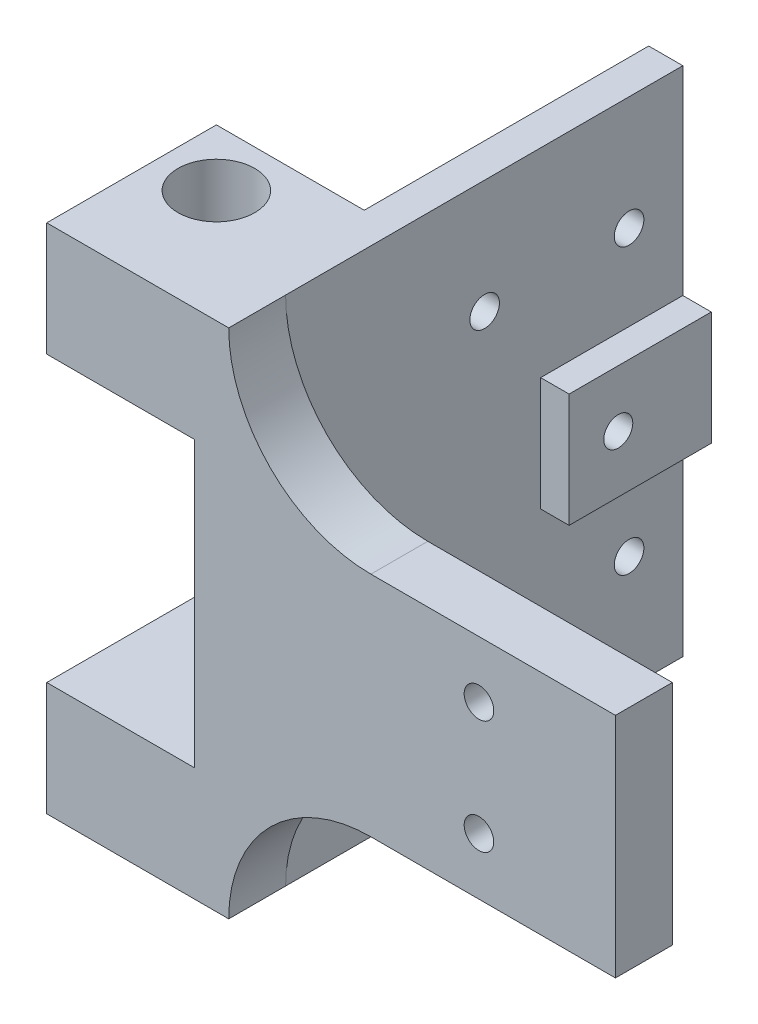
ISO-10303-21;
HEADER;
FILE_DESCRIPTION(('STEP AP214'),'2;1');
FILE_NAME('part.step','',(''),(''),'','','');
FILE_SCHEMA(('AUTOMOTIVE_DESIGN { 1 0 10303 214 1 1 1 1 }'));
ENDSEC;
DATA;
#1=APPLICATION_CONTEXT('core data for automotive mechanical design processes');
#2=APPLICATION_PROTOCOL_DEFINITION('international standard','automotive_design',2000,#1);
#3=PRODUCT_CONTEXT('',#1,'mechanical');
#4=PRODUCT('Part','Part','',(#3));
#5=PRODUCT_RELATED_PRODUCT_CATEGORY('part','',(#4));
#6=PRODUCT_DEFINITION_FORMATION('','',#4);
#7=PRODUCT_DEFINITION_CONTEXT('part definition',#1,'design');
#8=PRODUCT_DEFINITION('design','',#6,#7);
#9=PRODUCT_DEFINITION_SHAPE('','',#8);
#10=(LENGTH_UNIT() NAMED_UNIT(*) SI_UNIT(.MILLI.,.METRE.));
#11=(NAMED_UNIT(*) PLANE_ANGLE_UNIT() SI_UNIT($,.RADIAN.));
#12=(NAMED_UNIT(*) SI_UNIT($,.STERADIAN.) SOLID_ANGLE_UNIT());
#13=UNCERTAINTY_MEASURE_WITH_UNIT(LENGTH_MEASURE(1.E-05),#10,'distance_accuracy_value','');
#14=(GEOMETRIC_REPRESENTATION_CONTEXT(3) GLOBAL_UNCERTAINTY_ASSIGNED_CONTEXT((#13)) GLOBAL_UNIT_ASSIGNED_CONTEXT((#10,
#11,#12)) REPRESENTATION_CONTEXT('',''));
#15=CARTESIAN_POINT('',(0.,0.,0.));
#16=DIRECTION('',(0.,0.,1.));
#17=DIRECTION('',(1.,0.,0.));
#18=AXIS2_PLACEMENT_3D('',#15,#16,#17);
#19=CARTESIAN_POINT('',(6.,90.,-69.85));
#20=DIRECTION('',(-1.,0.,0.));
#21=DIRECTION('',(0.,-1.,0.));
#22=AXIS2_PLACEMENT_3D('',#19,#20,#21);
#23=PLANE('',#22);
#24=CARTESIAN_POINT('',(5.99999999999999,20.,-35.));
#25=DIRECTION('',(-1.,0.,0.));
#26=DIRECTION('',(0.,-1.,0.));
#27=AXIS2_PLACEMENT_3D('',#24,#25,#26);
#28=CIRCLE('',#27,2.6);
#29=CARTESIAN_POINT('',(5.99999999999999,17.4,-35.));
#30=VERTEX_POINT('',#29);
#31=EDGE_CURVE('E748',#30,#30,#28,.T.);
#32=ORIENTED_EDGE('',*,*,#31,.T.);
#33=EDGE_LOOP('',(#32));
#34=FACE_BOUND('',#33,.T.);
#35=CARTESIAN_POINT('',(6.00000000000001,70.,-60.4));
#36=DIRECTION('',(-1.,0.,0.));
#37=DIRECTION('',(0.,-1.,0.));
#38=AXIS2_PLACEMENT_3D('',#35,#36,#37);
#39=CIRCLE('',#38,2.6);
#40=CARTESIAN_POINT('',(6.00000000000001,67.4,-60.4));
#41=VERTEX_POINT('',#40);
#42=EDGE_CURVE('E750',#41,#41,#39,.T.);
#43=ORIENTED_EDGE('',*,*,#42,.T.);
#44=EDGE_LOOP('',(#43));
#45=FACE_BOUND('',#44,.T.);
#46=CARTESIAN_POINT('',(5.99999999999999,20.,-60.4));
#47=DIRECTION('',(-1.,0.,0.));
#48=DIRECTION('',(0.,-1.,0.));
#49=AXIS2_PLACEMENT_3D('',#46,#47,#48);
#50=CIRCLE('',#49,2.6);
#51=CARTESIAN_POINT('',(5.99999999999999,17.4,-60.4));
#52=VERTEX_POINT('',#51);
#53=EDGE_CURVE('E756',#52,#52,#50,.T.);
#54=ORIENTED_EDGE('',*,*,#53,.T.);
#55=EDGE_LOOP('',(#54));
#56=FACE_BOUND('',#55,.T.);
#57=CARTESIAN_POINT('',(6.00000000000001,70.,-35.));
#58=DIRECTION('',(-1.,0.,0.));
#59=DIRECTION('',(0.,-1.,0.));
#60=AXIS2_PLACEMENT_3D('',#57,#58,#59);
#61=CIRCLE('',#60,2.6);
#62=CARTESIAN_POINT('',(6.00000000000001,67.4,-35.));
#63=VERTEX_POINT('',#62);
#64=EDGE_CURVE('E753',#63,#63,#61,.T.);
#65=ORIENTED_EDGE('',*,*,#64,.T.);
#66=EDGE_LOOP('',(#65));
#67=FACE_BOUND('',#66,.T.);
#68=DIRECTION('',(0.,0.,-1.));
#69=VECTOR('',#68,1.);
#70=CARTESIAN_POINT('',(5.99999999999999,35.,-44.85));
#71=LINE('',#70,#69);
#72=CARTESIAN_POINT('',(5.99999999999999,35.,-44.85));
#73=VERTEX_POINT('',#72);
#74=CARTESIAN_POINT('',(5.99999999999999,35.,-69.85));
#75=VERTEX_POINT('',#74);
#76=EDGE_CURVE('E769',#73,#75,#71,.T.);
#77=ORIENTED_EDGE('',*,*,#76,.F.);
#78=DIRECTION('',(0.,-1.,0.));
#79=VECTOR('',#78,1.);
#80=CARTESIAN_POINT('',(6.,55.,-44.85));
#81=LINE('',#80,#79);
#82=CARTESIAN_POINT('',(6.,55.,-44.85));
#83=VERTEX_POINT('',#82);
#84=EDGE_CURVE('E187',#83,#73,#81,.T.);
#85=ORIENTED_EDGE('',*,*,#84,.F.);
#86=DIRECTION('',(0.,0.,1.));
#87=VECTOR('',#86,1.);
#88=CARTESIAN_POINT('',(6.,55.,-44.85));
#89=LINE('',#88,#87);
#90=CARTESIAN_POINT('',(6.,55.,-69.85));
#91=VERTEX_POINT('',#90);
#92=EDGE_CURVE('E183',#91,#83,#89,.T.);
#93=ORIENTED_EDGE('',*,*,#92,.F.);
#94=DIRECTION('',(0.,-1.,0.));
#95=VECTOR('',#94,1.);
#96=CARTESIAN_POINT('',(6.,90.,-69.85));
#97=LINE('',#96,#95);
#98=CARTESIAN_POINT('',(6.,90.,-69.85));
#99=VERTEX_POINT('',#98);
#100=EDGE_CURVE('E282',#99,#91,#97,.T.);
#101=ORIENTED_EDGE('',*,*,#100,.F.);
#102=DIRECTION('',(0.,0.,1.));
#103=VECTOR('',#102,1.);
#104=CARTESIAN_POINT('',(6.,90.,-69.85));
#105=LINE('',#104,#103);
#106=CARTESIAN_POINT('',(6.,90.,0.));
#107=VERTEX_POINT('',#106);
#108=EDGE_CURVE('E294',#99,#107,#105,.T.);
#109=ORIENTED_EDGE('',*,*,#108,.T.);
#110=DIRECTION('',(0.,-1.,0.));
#111=VECTOR('',#110,1.);
#112=CARTESIAN_POINT('',(6.,90.,0.));
#113=LINE('',#112,#111);
#114=CARTESIAN_POINT('',(5.99999999999999,0.,0.));
#115=VERTEX_POINT('',#114);
#116=EDGE_CURVE('E275',#107,#115,#113,.T.);
#117=ORIENTED_EDGE('',*,*,#116,.T.);
#118=DIRECTION('',(0.,0.,1.));
#119=VECTOR('',#118,1.);
#120=CARTESIAN_POINT('',(5.99999999999999,0.,-69.85));
#121=LINE('',#120,#119);
#122=CARTESIAN_POINT('',(5.99999999999999,0.,-69.85));
#123=VERTEX_POINT('',#122);
#124=EDGE_CURVE('E290',#123,#115,#121,.T.);
#125=ORIENTED_EDGE('',*,*,#124,.F.);
#126=EDGE_CURVE('E281',#75,#123,#97,.T.);
#127=ORIENTED_EDGE('',*,*,#126,.F.);
#128=EDGE_LOOP('',(#77,#85,#93,#101,#109,#117,#125,#127));
#129=FACE_BOUND('',#128,.T.);
#130=ADVANCED_FACE('F35',(#34,#45,#56,#67,#129),#23,.F.);
#131=CARTESIAN_POINT('',(0.,0.,10.));
#132=DIRECTION('',(1.,0.,0.));
#133=DIRECTION('',(0.,0.,-1.));
#134=AXIS2_PLACEMENT_3D('',#131,#132,#133);
#135=PLANE('',#134);
#136=CARTESIAN_POINT('',(0.,20.,-35.));
#137=DIRECTION('',(-1.,0.,0.));
#138=DIRECTION('',(0.,0.,1.));
#139=AXIS2_PLACEMENT_3D('',#136,#137,#138);
#140=CIRCLE('',#139,2.6);
#141=CARTESIAN_POINT('',(0.,20.,-32.4));
#142=VERTEX_POINT('',#141);
#143=EDGE_CURVE('E746',#142,#142,#140,.T.);
#144=ORIENTED_EDGE('',*,*,#143,.F.);
#145=EDGE_LOOP('',(#144));
#146=FACE_BOUND('',#145,.T.);
#147=CARTESIAN_POINT('',(0.,70.,-60.4));
#148=DIRECTION('',(-1.,0.,0.));
#149=DIRECTION('',(0.,0.,1.));
#150=AXIS2_PLACEMENT_3D('',#147,#148,#149);
#151=CIRCLE('',#150,2.6);
#152=CARTESIAN_POINT('',(0.,70.,-57.8));
#153=VERTEX_POINT('',#152);
#154=EDGE_CURVE('E792',#153,#153,#151,.T.);
#155=ORIENTED_EDGE('',*,*,#154,.F.);
#156=EDGE_LOOP('',(#155));
#157=FACE_BOUND('',#156,.T.);
#158=CARTESIAN_POINT('',(0.,20.,-60.4));
#159=DIRECTION('',(-1.,0.,0.));
#160=DIRECTION('',(0.,0.,1.));
#161=AXIS2_PLACEMENT_3D('',#158,#159,#160);
#162=CIRCLE('',#161,2.6);
#163=CARTESIAN_POINT('',(0.,20.,-57.8));
#164=VERTEX_POINT('',#163);
#165=EDGE_CURVE('E789',#164,#164,#162,.T.);
#166=ORIENTED_EDGE('',*,*,#165,.F.);
#167=EDGE_LOOP('',(#166));
#168=FACE_BOUND('',#167,.T.);
#169=CARTESIAN_POINT('',(0.,70.,-35.));
#170=DIRECTION('',(-1.,0.,0.));
#171=DIRECTION('',(0.,0.,1.));
#172=AXIS2_PLACEMENT_3D('',#169,#170,#171);
#173=CIRCLE('',#172,2.6);
#174=CARTESIAN_POINT('',(0.,70.,-32.4));
#175=VERTEX_POINT('',#174);
#176=EDGE_CURVE('E749',#175,#175,#173,.T.);
#177=ORIENTED_EDGE('',*,*,#176,.F.);
#178=EDGE_LOOP('',(#177));
#179=FACE_BOUND('',#178,.T.);
#180=CARTESIAN_POINT('',(0.,45.,-53.5));
#181=DIRECTION('',(-1.,0.,0.));
#182=DIRECTION('',(0.,0.,1.));
#183=AXIS2_PLACEMENT_3D('',#180,#181,#182);
#184=CIRCLE('',#183,6.35);
#185=CARTESIAN_POINT('',(0.,45.,-47.15));
#186=VERTEX_POINT('',#185);
#187=EDGE_CURVE('E189',#186,#186,#184,.T.);
#188=ORIENTED_EDGE('',*,*,#187,.F.);
#189=EDGE_LOOP('',(#188));
#190=FACE_BOUND('',#189,.T.);
#191=DIRECTION('',(0.,-1.,0.));
#192=VECTOR('',#191,1.);
#193=CARTESIAN_POINT('',(0.,70.,-19.83));
#194=LINE('',#193,#192);
#195=CARTESIAN_POINT('',(0.,90.,-19.83));
#196=VERTEX_POINT('',#195);
#197=CARTESIAN_POINT('',(0.,70.,-19.83));
#198=VERTEX_POINT('',#197);
#199=EDGE_CURVE('E210',#196,#198,#194,.T.);
#200=ORIENTED_EDGE('',*,*,#199,.F.);
#201=DIRECTION('',(0.,0.,-1.));
#202=VECTOR('',#201,1.);
#203=CARTESIAN_POINT('',(0.,90.,10.));
#204=LINE('',#203,#202);
#205=CARTESIAN_POINT('',(0.,90.,-69.85));
#206=VERTEX_POINT('',#205);
#207=EDGE_CURVE('E319',#196,#206,#204,.T.);
#208=ORIENTED_EDGE('',*,*,#207,.T.);
#209=DIRECTION('',(0.,1.,0.));
#210=VECTOR('',#209,1.);
#211=CARTESIAN_POINT('',(0.,90.,-69.85));
#212=LINE('',#211,#210);
#213=CARTESIAN_POINT('',(0.,0.,-69.85));
#214=VERTEX_POINT('',#213);
#215=EDGE_CURVE('E276',#214,#206,#212,.T.);
#216=ORIENTED_EDGE('',*,*,#215,.F.);
#217=DIRECTION('',(0.,0.,-1.));
#218=VECTOR('',#217,1.);
#219=CARTESIAN_POINT('',(0.,0.,10.));
#220=LINE('',#219,#218);
#221=CARTESIAN_POINT('',(0.,0.,-19.83));
#222=VERTEX_POINT('',#221);
#223=EDGE_CURVE('E322',#222,#214,#220,.T.);
#224=ORIENTED_EDGE('',*,*,#223,.F.);
#225=DIRECTION('',(0.,-1.,0.));
#226=VECTOR('',#225,1.);
#227=CARTESIAN_POINT('',(0.,0.,-19.83));
#228=LINE('',#227,#226);
#229=CARTESIAN_POINT('',(0.,20.,-19.83));
#230=VERTEX_POINT('',#229);
#231=EDGE_CURVE('E239',#230,#222,#228,.T.);
#232=ORIENTED_EDGE('',*,*,#231,.F.);
#233=DIRECTION('',(0.,0.,-1.));
#234=VECTOR('',#233,1.);
#235=CARTESIAN_POINT('',(0.,20.,10.));
#236=LINE('',#235,#234);
#237=CARTESIAN_POINT('',(0.,20.,10.));
#238=VERTEX_POINT('',#237);
#239=EDGE_CURVE('E234',#238,#230,#236,.T.);
#240=ORIENTED_EDGE('',*,*,#239,.F.);
#241=DIRECTION('',(0.,-1.,0.));
#242=VECTOR('',#241,1.);
#243=CARTESIAN_POINT('',(0.,0.,10.));
#244=LINE('',#243,#242);
#245=CARTESIAN_POINT('',(0.,70.,10.));
#246=VERTEX_POINT('',#245);
#247=EDGE_CURVE('E310',#246,#238,#244,.T.);
#248=ORIENTED_EDGE('',*,*,#247,.F.);
#249=DIRECTION('',(0.,0.,1.));
#250=VECTOR('',#249,1.);
#251=CARTESIAN_POINT('',(0.,70.,-19.83));
#252=LINE('',#251,#250);
#253=EDGE_CURVE('E59',#198,#246,#252,.T.);
#254=ORIENTED_EDGE('',*,*,#253,.F.);
#255=EDGE_LOOP('',(#200,#208,#216,#224,#232,#240,#248,#254));
#256=FACE_BOUND('',#255,.T.);
#257=ADVANCED_FACE('F371',(#146,#157,#168,#179,#190,#256),#135,.F.);
#258=CARTESIAN_POINT('',(0.,0.,10.));
#259=DIRECTION('',(0.,0.,-1.));
#260=DIRECTION('',(-1.,0.,0.));
#261=AXIS2_PLACEMENT_3D('',#258,#259,#260);
#262=PLANE('',#261);
#263=DIRECTION('',(1.,0.,0.));
#264=VECTOR('',#263,1.);
#265=CARTESIAN_POINT('',(0.,0.,10.));
#266=LINE('',#265,#264);
#267=CARTESIAN_POINT('',(-26.,0.,10.));
#268=VERTEX_POINT('',#267);
#269=CARTESIAN_POINT('',(5.99999999999999,0.,10.));
#270=VERTEX_POINT('',#269);
#271=EDGE_CURVE('E312',#268,#270,#266,.T.);
#272=ORIENTED_EDGE('',*,*,#271,.T.);
#273=CARTESIAN_POINT('',(31.,0.,10.));
#274=DIRECTION('',(0.,0.,-1.));
#275=DIRECTION('',(-1.,0.,0.));
#276=AXIS2_PLACEMENT_3D('',#273,#274,#275);
#277=CIRCLE('',#276,25.);
#278=CARTESIAN_POINT('',(31.,25.,10.));
#279=VERTEX_POINT('',#278);
#280=EDGE_CURVE('E332',#270,#279,#277,.T.);
#281=ORIENTED_EDGE('',*,*,#280,.T.);
#282=DIRECTION('',(1.,0.,0.));
#283=VECTOR('',#282,1.);
#284=CARTESIAN_POINT('',(74.,25.,10.));
#285=LINE('',#284,#283);
#286=CARTESIAN_POINT('',(74.,25.,10.));
#287=VERTEX_POINT('',#286);
#288=EDGE_CURVE('E260',#279,#287,#285,.T.);
#289=ORIENTED_EDGE('',*,*,#288,.T.);
#290=DIRECTION('',(0.,1.,0.));
#291=VECTOR('',#290,1.);
#292=CARTESIAN_POINT('',(74.,0.,10.));
#293=LINE('',#292,#291);
#294=CARTESIAN_POINT('',(74.,65.,10.));
#295=VERTEX_POINT('',#294);
#296=EDGE_CURVE('E315',#287,#295,#293,.T.);
#297=ORIENTED_EDGE('',*,*,#296,.T.);
#298=DIRECTION('',(-1.,0.,0.));
#299=VECTOR('',#298,1.);
#300=CARTESIAN_POINT('',(74.,65.,10.));
#301=LINE('',#300,#299);
#302=CARTESIAN_POINT('',(31.,65.,10.));
#303=VERTEX_POINT('',#302);
#304=EDGE_CURVE('E267',#295,#303,#301,.T.);
#305=ORIENTED_EDGE('',*,*,#304,.T.);
#306=CARTESIAN_POINT('',(31.,90.,9.99999999999999));
#307=DIRECTION('',(0.,0.,-1.));
#308=DIRECTION('',(-1.,0.,0.));
#309=AXIS2_PLACEMENT_3D('',#306,#307,#308);
#310=CIRCLE('',#309,25.);
#311=CARTESIAN_POINT('',(6.,90.,10.));
#312=VERTEX_POINT('',#311);
#313=EDGE_CURVE('E11',#303,#312,#310,.T.);
#314=ORIENTED_EDGE('',*,*,#313,.T.);
#315=DIRECTION('',(-1.,0.,0.));
#316=VECTOR('',#315,1.);
#317=CARTESIAN_POINT('',(0.,90.,10.));
#318=LINE('',#317,#316);
#319=CARTESIAN_POINT('',(-26.,90.,10.));
#320=VERTEX_POINT('',#319);
#321=EDGE_CURVE('E317',#312,#320,#318,.T.);
#322=ORIENTED_EDGE('',*,*,#321,.T.);
#323=DIRECTION('',(0.,1.,0.));
#324=VECTOR('',#323,1.);
#325=CARTESIAN_POINT('',(-26.,70.,10.));
#326=LINE('',#325,#324);
#327=CARTESIAN_POINT('',(-26.,70.,10.));
#328=VERTEX_POINT('',#327);
#329=EDGE_CURVE('E218',#328,#320,#326,.T.);
#330=ORIENTED_EDGE('',*,*,#329,.F.);
#331=DIRECTION('',(1.,0.,0.));
#332=VECTOR('',#331,1.);
#333=CARTESIAN_POINT('',(-26.,70.,10.));
#334=LINE('',#333,#332);
#335=EDGE_CURVE('E229',#328,#246,#334,.T.);
#336=ORIENTED_EDGE('',*,*,#335,.T.);
#337=ORIENTED_EDGE('',*,*,#247,.T.);
#338=DIRECTION('',(1.,0.,0.));
#339=VECTOR('',#338,1.);
#340=CARTESIAN_POINT('',(-26.,20.,10.));
#341=LINE('',#340,#339);
#342=CARTESIAN_POINT('',(-26.,20.,10.));
#343=VERTEX_POINT('',#342);
#344=EDGE_CURVE('E256',#343,#238,#341,.T.);
#345=ORIENTED_EDGE('',*,*,#344,.F.);
#346=DIRECTION('',(0.,1.,0.));
#347=VECTOR('',#346,1.);
#348=CARTESIAN_POINT('',(-26.,0.,10.));
#349=LINE('',#348,#347);
#350=EDGE_CURVE('E235',#268,#343,#349,.T.);
#351=ORIENTED_EDGE('',*,*,#350,.F.);
#352=EDGE_LOOP('',(#272,#281,#289,#297,#305,#314,#322,#330,#336,#337,#345,#351));
#353=FACE_BOUND('',#352,.T.);
#354=CARTESIAN_POINT('',(50.,55.,10.));
#355=DIRECTION('',(0.,0.,1.));
#356=DIRECTION('',(1.,0.,0.));
#357=AXIS2_PLACEMENT_3D('',#354,#355,#356);
#358=CIRCLE('',#357,2.6);
#359=CARTESIAN_POINT('',(52.6,55.,10.));
#360=VERTEX_POINT('',#359);
#361=EDGE_CURVE('E304',#360,#360,#358,.T.);
#362=ORIENTED_EDGE('',*,*,#361,.F.);
#363=EDGE_LOOP('',(#362));
#364=FACE_BOUND('',#363,.T.);
#365=CARTESIAN_POINT('',(50.,35.,10.));
#366=DIRECTION('',(0.,0.,1.));
#367=DIRECTION('',(1.,0.,0.));
#368=AXIS2_PLACEMENT_3D('',#365,#366,#367);
#369=CIRCLE('',#368,2.6);
#370=CARTESIAN_POINT('',(52.6,35.,10.));
#371=VERTEX_POINT('',#370);
#372=EDGE_CURVE('E298',#371,#371,#369,.T.);
#373=ORIENTED_EDGE('',*,*,#372,.F.);
#374=EDGE_LOOP('',(#373));
#375=FACE_BOUND('',#374,.T.);
#376=ADVANCED_FACE('F352',(#353,#364,#375),#262,.F.);
#377=CARTESIAN_POINT('',(0.,0.,0.));
#378=DIRECTION('',(0.,0.,-1.));
#379=DIRECTION('',(-1.,0.,0.));
#380=AXIS2_PLACEMENT_3D('',#377,#378,#379);
#381=PLANE('',#380);
#382=DIRECTION('',(1.,0.,0.));
#383=VECTOR('',#382,1.);
#384=CARTESIAN_POINT('',(74.,25.,0.));
#385=LINE('',#384,#383);
#386=CARTESIAN_POINT('',(31.,25.,0.));
#387=VERTEX_POINT('',#386);
#388=CARTESIAN_POINT('',(74.,25.,0.));
#389=VERTEX_POINT('',#388);
#390=EDGE_CURVE('E259',#387,#389,#385,.T.);
#391=ORIENTED_EDGE('',*,*,#390,.F.);
#392=CARTESIAN_POINT('',(31.,0.,0.));
#393=DIRECTION('',(0.,0.,-1.));
#394=DIRECTION('',(-1.,0.,0.));
#395=AXIS2_PLACEMENT_3D('',#392,#393,#394);
#396=CIRCLE('',#395,25.);
#397=EDGE_CURVE('E329',#387,#115,#396,.F.);
#398=ORIENTED_EDGE('',*,*,#397,.T.);
#399=ORIENTED_EDGE('',*,*,#116,.F.);
#400=CARTESIAN_POINT('',(31.,90.,0.));
#401=DIRECTION('',(0.,0.,-1.));
#402=DIRECTION('',(-1.,0.,0.));
#403=AXIS2_PLACEMENT_3D('',#400,#401,#402);
#404=CIRCLE('',#403,25.);
#405=CARTESIAN_POINT('',(31.,65.,0.));
#406=VERTEX_POINT('',#405);
#407=EDGE_CURVE('E44',#107,#406,#404,.F.);
#408=ORIENTED_EDGE('',*,*,#407,.T.);
#409=DIRECTION('',(-1.,0.,0.));
#410=VECTOR('',#409,1.);
#411=CARTESIAN_POINT('',(74.,65.,0.));
#412=LINE('',#411,#410);
#413=CARTESIAN_POINT('',(74.,65.,0.));
#414=VERTEX_POINT('',#413);
#415=EDGE_CURVE('E266',#414,#406,#412,.T.);
#416=ORIENTED_EDGE('',*,*,#415,.F.);
#417=DIRECTION('',(0.,1.,0.));
#418=VECTOR('',#417,1.);
#419=CARTESIAN_POINT('',(74.,0.,0.));
#420=LINE('',#419,#418);
#421=EDGE_CURVE('E307',#389,#414,#420,.T.);
#422=ORIENTED_EDGE('',*,*,#421,.F.);
#423=EDGE_LOOP('',(#391,#398,#399,#408,#416,#422));
#424=FACE_BOUND('',#423,.T.);
#425=CARTESIAN_POINT('',(50.,55.,0.));
#426=DIRECTION('',(0.,0.,1.));
#427=DIRECTION('',(1.,0.,0.));
#428=AXIS2_PLACEMENT_3D('',#425,#426,#427);
#429=CIRCLE('',#428,2.6);
#430=CARTESIAN_POINT('',(52.6,55.,0.));
#431=VERTEX_POINT('',#430);
#432=EDGE_CURVE('E301',#431,#431,#429,.T.);
#433=ORIENTED_EDGE('',*,*,#432,.T.);
#434=EDGE_LOOP('',(#433));
#435=FACE_BOUND('',#434,.T.);
#436=CARTESIAN_POINT('',(50.,35.,0.));
#437=DIRECTION('',(0.,0.,1.));
#438=DIRECTION('',(1.,0.,0.));
#439=AXIS2_PLACEMENT_3D('',#436,#437,#438);
#440=CIRCLE('',#439,2.6);
#441=CARTESIAN_POINT('',(52.6,35.,0.));
#442=VERTEX_POINT('',#441);
#443=EDGE_CURVE('E297',#442,#442,#440,.T.);
#444=ORIENTED_EDGE('',*,*,#443,.T.);
#445=EDGE_LOOP('',(#444));
#446=FACE_BOUND('',#445,.T.);
#447=ADVANCED_FACE('F338',(#424,#435,#446),#381,.T.);
#448=CARTESIAN_POINT('',(0.,0.,10.));
#449=DIRECTION('',(0.,1.,0.));
#450=DIRECTION('',(0.,0.,1.));
#451=AXIS2_PLACEMENT_3D('',#448,#449,#450);
#452=PLANE('',#451);
#453=CARTESIAN_POINT('',(-16.,0.,-9.83));
#454=DIRECTION('',(0.,-1.,0.));
#455=DIRECTION('',(0.,0.,-1.));
#456=AXIS2_PLACEMENT_3D('',#453,#454,#455);
#457=CIRCLE('',#456,6.75);
#458=CARTESIAN_POINT('',(-16.,0.,-16.58));
#459=VERTEX_POINT('',#458);
#460=EDGE_CURVE('E204',#459,#459,#457,.T.);
#461=ORIENTED_EDGE('',*,*,#460,.F.);
#462=EDGE_LOOP('',(#461));
#463=FACE_BOUND('',#462,.T.);
#464=ORIENTED_EDGE('',*,*,#124,.T.);
#465=EDGE_CURVE('E288',#115,#270,#121,.T.);
#466=ORIENTED_EDGE('',*,*,#465,.T.);
#467=ORIENTED_EDGE('',*,*,#271,.F.);
#468=DIRECTION('',(0.,0.,1.));
#469=VECTOR('',#468,1.);
#470=CARTESIAN_POINT('',(-26.,0.,10.));
#471=LINE('',#470,#469);
#472=CARTESIAN_POINT('',(-26.,0.,-19.83));
#473=VERTEX_POINT('',#472);
#474=EDGE_CURVE('E243',#473,#268,#471,.T.);
#475=ORIENTED_EDGE('',*,*,#474,.F.);
#476=DIRECTION('',(1.,0.,0.));
#477=VECTOR('',#476,1.);
#478=CARTESIAN_POINT('',(-26.,0.,-19.83));
#479=LINE('',#478,#477);
#480=EDGE_CURVE('E246',#473,#222,#479,.T.);
#481=ORIENTED_EDGE('',*,*,#480,.T.);
#482=ORIENTED_EDGE('',*,*,#223,.T.);
#483=DIRECTION('',(-1.,0.,0.));
#484=VECTOR('',#483,1.);
#485=CARTESIAN_POINT('',(0.,0.,-69.85));
#486=LINE('',#485,#484);
#487=EDGE_CURVE('E285',#123,#214,#486,.T.);
#488=ORIENTED_EDGE('',*,*,#487,.F.);
#489=EDGE_LOOP('',(#464,#466,#467,#475,#481,#482,#488));
#490=FACE_BOUND('',#489,.T.);
#491=ADVANCED_FACE('F380',(#463,#490),#452,.F.);
#492=CARTESIAN_POINT('',(74.,0.,10.));
#493=DIRECTION('',(-1.,0.,0.));
#494=DIRECTION('',(0.,0.,1.));
#495=AXIS2_PLACEMENT_3D('',#492,#493,#494);
#496=PLANE('',#495);
#497=ORIENTED_EDGE('',*,*,#296,.F.);
#498=DIRECTION('',(0.,0.,-1.));
#499=VECTOR('',#498,1.);
#500=CARTESIAN_POINT('',(74.,25.,10.));
#501=LINE('',#500,#499);
#502=EDGE_CURVE('E262',#287,#389,#501,.T.);
#503=ORIENTED_EDGE('',*,*,#502,.T.);
#504=ORIENTED_EDGE('',*,*,#421,.T.);
#505=DIRECTION('',(0.,0.,-1.));
#506=VECTOR('',#505,1.);
#507=CARTESIAN_POINT('',(74.,65.,10.));
#508=LINE('',#507,#506);
#509=EDGE_CURVE('E270',#295,#414,#508,.T.);
#510=ORIENTED_EDGE('',*,*,#509,.F.);
#511=EDGE_LOOP('',(#497,#503,#504,#510));
#512=FACE_BOUND('',#511,.T.);
#513=ADVANCED_FACE('F403',(#512),#496,.F.);
#514=CARTESIAN_POINT('',(0.,90.,10.));
#515=DIRECTION('',(0.,-1.,0.));
#516=DIRECTION('',(0.,0.,-1.));
#517=AXIS2_PLACEMENT_3D('',#514,#515,#516);
#518=PLANE('',#517);
#519=CARTESIAN_POINT('',(-16.,90.,-9.83));
#520=DIRECTION('',(0.,1.,0.));
#521=DIRECTION('',(0.,0.,1.));
#522=AXIS2_PLACEMENT_3D('',#519,#520,#521);
#523=CIRCLE('',#522,6.75);
#524=CARTESIAN_POINT('',(-16.,90.,-3.08));
#525=VERTEX_POINT('',#524);
#526=EDGE_CURVE('E199',#525,#525,#523,.T.);
#527=ORIENTED_EDGE('',*,*,#526,.F.);
#528=EDGE_LOOP('',(#527));
#529=FACE_BOUND('',#528,.T.);
#530=ORIENTED_EDGE('',*,*,#321,.F.);
#531=EDGE_CURVE('E293',#107,#312,#105,.T.);
#532=ORIENTED_EDGE('',*,*,#531,.F.);
#533=ORIENTED_EDGE('',*,*,#108,.F.);
#534=DIRECTION('',(1.,0.,0.));
#535=VECTOR('',#534,1.);
#536=CARTESIAN_POINT('',(0.,90.,-69.85));
#537=LINE('',#536,#535);
#538=EDGE_CURVE('E279',#206,#99,#537,.T.);
#539=ORIENTED_EDGE('',*,*,#538,.F.);
#540=ORIENTED_EDGE('',*,*,#207,.F.);
#541=DIRECTION('',(1.,0.,0.));
#542=VECTOR('',#541,1.);
#543=CARTESIAN_POINT('',(-26.,90.,-19.83));
#544=LINE('',#543,#542);
#545=CARTESIAN_POINT('',(-26.,90.,-19.83));
#546=VERTEX_POINT('',#545);
#547=EDGE_CURVE('E223',#546,#196,#544,.T.);
#548=ORIENTED_EDGE('',*,*,#547,.F.);
#549=DIRECTION('',(0.,0.,-1.));
#550=VECTOR('',#549,1.);
#551=CARTESIAN_POINT('',(-26.,90.,-19.83));
#552=LINE('',#551,#550);
#553=EDGE_CURVE('E221',#320,#546,#552,.T.);
#554=ORIENTED_EDGE('',*,*,#553,.F.);
#555=EDGE_LOOP('',(#530,#532,#533,#539,#540,#548,#554));
#556=FACE_BOUND('',#555,.T.);
#557=ADVANCED_FACE('F357',(#529,#556),#518,.F.);
#558=CARTESIAN_POINT('',(50.,55.,10.));
#559=DIRECTION('',(0.,0.,-1.));
#560=DIRECTION('',(-1.,0.,0.));
#561=AXIS2_PLACEMENT_3D('',#558,#559,#560);
#562=CYLINDRICAL_SURFACE('',#561,2.6);
#563=ORIENTED_EDGE('',*,*,#361,.T.);
#564=EDGE_LOOP('',(#563));
#565=FACE_BOUND('',#564,.T.);
#566=ORIENTED_EDGE('',*,*,#432,.F.);
#567=EDGE_LOOP('',(#566));
#568=FACE_BOUND('',#567,.T.);
#569=ADVANCED_FACE('F410',(#565,#568),#562,.F.);
#570=CARTESIAN_POINT('',(50.,35.,10.));
#571=DIRECTION('',(0.,0.,-1.));
#572=DIRECTION('',(-1.,0.,0.));
#573=AXIS2_PLACEMENT_3D('',#570,#571,#572);
#574=CYLINDRICAL_SURFACE('',#573,2.6);
#575=ORIENTED_EDGE('',*,*,#372,.T.);
#576=EDGE_LOOP('',(#575));
#577=FACE_BOUND('',#576,.T.);
#578=ORIENTED_EDGE('',*,*,#443,.F.);
#579=EDGE_LOOP('',(#578));
#580=FACE_BOUND('',#579,.T.);
#581=ADVANCED_FACE('F428',(#577,#580),#574,.F.);
#582=CARTESIAN_POINT('',(0.,0.,-69.85));
#583=DIRECTION('',(0.,0.,1.));
#584=DIRECTION('',(1.,0.,0.));
#585=AXIS2_PLACEMENT_3D('',#582,#583,#584);
#586=PLANE('',#585);
#587=ORIENTED_EDGE('',*,*,#215,.T.);
#588=ORIENTED_EDGE('',*,*,#538,.T.);
#589=ORIENTED_EDGE('',*,*,#100,.T.);
#590=DIRECTION('',(-1.,0.,0.));
#591=VECTOR('',#590,1.);
#592=CARTESIAN_POINT('',(11.,55.,-69.85));
#593=LINE('',#592,#591);
#594=CARTESIAN_POINT('',(11.,55.,-69.85));
#595=VERTEX_POINT('',#594);
#596=EDGE_CURVE('E194',#595,#91,#593,.T.);
#597=ORIENTED_EDGE('',*,*,#596,.F.);
#598=DIRECTION('',(0.,1.,0.));
#599=VECTOR('',#598,1.);
#600=CARTESIAN_POINT('',(11.,55.,-69.85));
#601=LINE('',#600,#599);
#602=CARTESIAN_POINT('',(11.,35.,-69.85));
#603=VERTEX_POINT('',#602);
#604=EDGE_CURVE('E173',#603,#595,#601,.T.);
#605=ORIENTED_EDGE('',*,*,#604,.F.);
#606=DIRECTION('',(-1.,0.,0.));
#607=VECTOR('',#606,1.);
#608=CARTESIAN_POINT('',(11.,35.,-69.85));
#609=LINE('',#608,#607);
#610=EDGE_CURVE('E51',#603,#75,#609,.T.);
#611=ORIENTED_EDGE('',*,*,#610,.T.);
#612=ORIENTED_EDGE('',*,*,#126,.T.);
#613=ORIENTED_EDGE('',*,*,#487,.T.);
#614=EDGE_LOOP('',(#587,#588,#589,#597,#605,#611,#612,#613));
#615=FACE_BOUND('',#614,.T.);
#616=ADVANCED_FACE('F375',(#615),#586,.F.);
#617=CARTESIAN_POINT('',(74.,65.,10.));
#618=DIRECTION('',(0.,-1.,0.));
#619=DIRECTION('',(0.,0.,-1.));
#620=AXIS2_PLACEMENT_3D('',#617,#618,#619);
#621=PLANE('',#620);
#622=ORIENTED_EDGE('',*,*,#415,.T.);
#623=DIRECTION('',(0.,0.,-1.));
#624=VECTOR('',#623,1.);
#625=CARTESIAN_POINT('',(31.,65.,9.99999999999999));
#626=LINE('',#625,#624);
#627=EDGE_CURVE('E327',#406,#303,#626,.F.);
#628=ORIENTED_EDGE('',*,*,#627,.T.);
#629=ORIENTED_EDGE('',*,*,#304,.F.);
#630=ORIENTED_EDGE('',*,*,#509,.T.);
#631=EDGE_LOOP('',(#622,#628,#629,#630));
#632=FACE_BOUND('',#631,.T.);
#633=ADVANCED_FACE('F346',(#632),#621,.F.);
#634=CARTESIAN_POINT('',(74.,25.,10.));
#635=DIRECTION('',(0.,1.,0.));
#636=DIRECTION('',(-1.,0.,0.));
#637=AXIS2_PLACEMENT_3D('',#634,#635,#636);
#638=PLANE('',#637);
#639=ORIENTED_EDGE('',*,*,#288,.F.);
#640=DIRECTION('',(0.,0.,-1.));
#641=VECTOR('',#640,1.);
#642=CARTESIAN_POINT('',(31.,25.,0.));
#643=LINE('',#642,#641);
#644=EDGE_CURVE('E324',#279,#387,#643,.T.);
#645=ORIENTED_EDGE('',*,*,#644,.T.);
#646=ORIENTED_EDGE('',*,*,#390,.T.);
#647=ORIENTED_EDGE('',*,*,#502,.F.);
#648=EDGE_LOOP('',(#639,#645,#646,#647));
#649=FACE_BOUND('',#648,.T.);
#650=ADVANCED_FACE('F400',(#649),#638,.F.);
#651=CARTESIAN_POINT('',(31.,0.,10.));
#652=DIRECTION('',(0.,0.,1.));
#653=DIRECTION('',(1.,0.,0.));
#654=AXIS2_PLACEMENT_3D('',#651,#652,#653);
#655=CYLINDRICAL_SURFACE('',#654,25.);
#656=ORIENTED_EDGE('',*,*,#280,.F.);
#657=ORIENTED_EDGE('',*,*,#465,.F.);
#658=ORIENTED_EDGE('',*,*,#397,.F.);
#659=ORIENTED_EDGE('',*,*,#644,.F.);
#660=EDGE_LOOP('',(#656,#657,#658,#659));
#661=FACE_BOUND('',#660,.T.);
#662=ADVANCED_FACE('F395',(#661),#655,.F.);
#663=CARTESIAN_POINT('',(31.,90.,-69.85));
#664=DIRECTION('',(0.,0.,1.));
#665=DIRECTION('',(1.,0.,0.));
#666=AXIS2_PLACEMENT_3D('',#663,#664,#665);
#667=CYLINDRICAL_SURFACE('',#666,25.);
#668=ORIENTED_EDGE('',*,*,#313,.F.);
#669=ORIENTED_EDGE('',*,*,#627,.F.);
#670=ORIENTED_EDGE('',*,*,#407,.F.);
#671=ORIENTED_EDGE('',*,*,#531,.T.);
#672=EDGE_LOOP('',(#668,#669,#670,#671));
#673=FACE_BOUND('',#672,.T.);
#674=ADVANCED_FACE('F37',(#673),#667,.F.);
#675=CARTESIAN_POINT('',(-26.,20.,10.));
#676=DIRECTION('',(0.,-1.,0.));
#677=DIRECTION('',(0.,0.,-1.));
#678=AXIS2_PLACEMENT_3D('',#675,#676,#677);
#679=PLANE('',#678);
#680=ORIENTED_EDGE('',*,*,#239,.T.);
#681=DIRECTION('',(1.,0.,0.));
#682=VECTOR('',#681,1.);
#683=CARTESIAN_POINT('',(-26.,20.,-19.83));
#684=LINE('',#683,#682);
#685=CARTESIAN_POINT('',(-26.,20.,-19.83));
#686=VERTEX_POINT('',#685);
#687=EDGE_CURVE('E253',#686,#230,#684,.T.);
#688=ORIENTED_EDGE('',*,*,#687,.F.);
#689=DIRECTION('',(0.,0.,-1.));
#690=VECTOR('',#689,1.);
#691=CARTESIAN_POINT('',(-26.,20.,10.));
#692=LINE('',#691,#690);
#693=EDGE_CURVE('E238',#343,#686,#692,.T.);
#694=ORIENTED_EDGE('',*,*,#693,.F.);
#695=ORIENTED_EDGE('',*,*,#344,.T.);
#696=EDGE_LOOP('',(#680,#688,#694,#695));
#697=FACE_BOUND('',#696,.T.);
#698=ADVANCED_FACE('F389',(#697),#679,.F.);
#699=CARTESIAN_POINT('',(-26.,0.,-19.83));
#700=DIRECTION('',(0.,0.,1.));
#701=DIRECTION('',(1.,0.,0.));
#702=AXIS2_PLACEMENT_3D('',#699,#700,#701);
#703=PLANE('',#702);
#704=ORIENTED_EDGE('',*,*,#231,.T.);
#705=ORIENTED_EDGE('',*,*,#480,.F.);
#706=DIRECTION('',(0.,-1.,0.));
#707=VECTOR('',#706,1.);
#708=CARTESIAN_POINT('',(-26.,0.,-19.83));
#709=LINE('',#708,#707);
#710=EDGE_CURVE('E241',#686,#473,#709,.T.);
#711=ORIENTED_EDGE('',*,*,#710,.F.);
#712=ORIENTED_EDGE('',*,*,#687,.T.);
#713=EDGE_LOOP('',(#704,#705,#711,#712));
#714=FACE_BOUND('',#713,.T.);
#715=ADVANCED_FACE('F385',(#714),#703,.F.);
#716=CARTESIAN_POINT('',(-26.,0.,0.));
#717=DIRECTION('',(-1.,0.,0.));
#718=DIRECTION('',(0.,0.,1.));
#719=AXIS2_PLACEMENT_3D('',#716,#717,#718);
#720=PLANE('',#719);
#721=ORIENTED_EDGE('',*,*,#350,.T.);
#722=ORIENTED_EDGE('',*,*,#693,.T.);
#723=ORIENTED_EDGE('',*,*,#710,.T.);
#724=ORIENTED_EDGE('',*,*,#474,.T.);
#725=EDGE_LOOP('',(#721,#722,#723,#724));
#726=FACE_BOUND('',#725,.T.);
#727=ADVANCED_FACE('F393',(#726),#720,.T.);
#728=CARTESIAN_POINT('',(-26.,70.,-19.83));
#729=DIRECTION('',(0.,0.,1.));
#730=DIRECTION('',(1.,0.,0.));
#731=AXIS2_PLACEMENT_3D('',#728,#729,#730);
#732=PLANE('',#731);
#733=ORIENTED_EDGE('',*,*,#199,.T.);
#734=DIRECTION('',(1.,0.,0.));
#735=VECTOR('',#734,1.);
#736=CARTESIAN_POINT('',(-26.,70.,-19.83));
#737=LINE('',#736,#735);
#738=CARTESIAN_POINT('',(-26.,70.,-19.83));
#739=VERTEX_POINT('',#738);
#740=EDGE_CURVE('E232',#739,#198,#737,.T.);
#741=ORIENTED_EDGE('',*,*,#740,.F.);
#742=DIRECTION('',(0.,-1.,0.));
#743=VECTOR('',#742,1.);
#744=CARTESIAN_POINT('',(-26.,70.,-19.83));
#745=LINE('',#744,#743);
#746=EDGE_CURVE('E213',#546,#739,#745,.T.);
#747=ORIENTED_EDGE('',*,*,#746,.F.);
#748=ORIENTED_EDGE('',*,*,#547,.T.);
#749=EDGE_LOOP('',(#733,#741,#747,#748));
#750=FACE_BOUND('',#749,.T.);
#751=ADVANCED_FACE('F370',(#750),#732,.F.);
#752=CARTESIAN_POINT('',(-26.,70.,-19.83));
#753=DIRECTION('',(0.,1.,0.));
#754=DIRECTION('',(0.,0.,1.));
#755=AXIS2_PLACEMENT_3D('',#752,#753,#754);
#756=PLANE('',#755);
#757=ORIENTED_EDGE('',*,*,#253,.T.);
#758=ORIENTED_EDGE('',*,*,#335,.F.);
#759=DIRECTION('',(0.,0.,1.));
#760=VECTOR('',#759,1.);
#761=CARTESIAN_POINT('',(-26.,70.,-19.83));
#762=LINE('',#761,#760);
#763=EDGE_CURVE('E216',#739,#328,#762,.T.);
#764=ORIENTED_EDGE('',*,*,#763,.F.);
#765=ORIENTED_EDGE('',*,*,#740,.T.);
#766=EDGE_LOOP('',(#757,#758,#764,#765));
#767=FACE_BOUND('',#766,.T.);
#768=ADVANCED_FACE('F368',(#767),#756,.F.);
#769=CARTESIAN_POINT('',(-26.,0.,0.));
#770=DIRECTION('',(1.,0.,0.));
#771=DIRECTION('',(0.,0.,-1.));
#772=AXIS2_PLACEMENT_3D('',#769,#770,#771);
#773=PLANE('',#772);
#774=ORIENTED_EDGE('',*,*,#746,.T.);
#775=ORIENTED_EDGE('',*,*,#763,.T.);
#776=ORIENTED_EDGE('',*,*,#329,.T.);
#777=ORIENTED_EDGE('',*,*,#553,.T.);
#778=EDGE_LOOP('',(#774,#775,#776,#777));
#779=FACE_BOUND('',#778,.T.);
#780=ADVANCED_FACE('F362',(#779),#773,.F.);
#781=CARTESIAN_POINT('',(-16.,10.,-9.83));
#782=DIRECTION('',(0.,-1.,0.));
#783=DIRECTION('',(0.,0.,-1.));
#784=AXIS2_PLACEMENT_3D('',#781,#782,#783);
#785=CYLINDRICAL_SURFACE('',#784,6.75);
#786=CARTESIAN_POINT('',(-16.,10.,-9.83));
#787=DIRECTION('',(0.,-1.,0.));
#788=DIRECTION('',(0.,0.,-1.));
#789=AXIS2_PLACEMENT_3D('',#786,#787,#788);
#790=CIRCLE('',#789,6.75);
#791=CARTESIAN_POINT('',(-16.,10.,-16.58));
#792=VERTEX_POINT('',#791);
#793=EDGE_CURVE('E207',#792,#792,#790,.T.);
#794=ORIENTED_EDGE('',*,*,#793,.F.);
#795=EDGE_LOOP('',(#794));
#796=FACE_BOUND('',#795,.T.);
#797=ORIENTED_EDGE('',*,*,#460,.T.);
#798=EDGE_LOOP('',(#797));
#799=FACE_BOUND('',#798,.T.);
#800=ADVANCED_FACE('F460',(#796,#799),#785,.F.);
#801=CARTESIAN_POINT('',(-16.,10.,-9.83));
#802=DIRECTION('',(0.,-1.,0.));
#803=DIRECTION('',(0.,0.,-1.));
#804=AXIS2_PLACEMENT_3D('',#801,#802,#803);
#805=PLANE('',#804);
#806=ORIENTED_EDGE('',*,*,#793,.T.);
#807=EDGE_LOOP('',(#806));
#808=FACE_BOUND('',#807,.T.);
#809=ADVANCED_FACE('F465',(#808),#805,.T.);
#810=CARTESIAN_POINT('',(-16.,80.,-9.83));
#811=DIRECTION('',(0.,1.,0.));
#812=DIRECTION('',(0.,0.,1.));
#813=AXIS2_PLACEMENT_3D('',#810,#811,#812);
#814=CYLINDRICAL_SURFACE('',#813,6.75);
#815=CARTESIAN_POINT('',(-16.,80.,-9.83));
#816=DIRECTION('',(0.,1.,0.));
#817=DIRECTION('',(0.,0.,1.));
#818=AXIS2_PLACEMENT_3D('',#815,#816,#817);
#819=CIRCLE('',#818,6.75);
#820=CARTESIAN_POINT('',(-16.,80.,-3.08));
#821=VERTEX_POINT('',#820);
#822=EDGE_CURVE('E201',#821,#821,#819,.T.);
#823=ORIENTED_EDGE('',*,*,#822,.F.);
#824=EDGE_LOOP('',(#823));
#825=FACE_BOUND('',#824,.T.);
#826=ORIENTED_EDGE('',*,*,#526,.T.);
#827=EDGE_LOOP('',(#826));
#828=FACE_BOUND('',#827,.T.);
#829=ADVANCED_FACE('F475',(#825,#828),#814,.F.);
#830=CARTESIAN_POINT('',(-16.,80.,-9.83));
#831=DIRECTION('',(0.,1.,0.));
#832=DIRECTION('',(0.,0.,1.));
#833=AXIS2_PLACEMENT_3D('',#830,#831,#832);
#834=PLANE('',#833);
#835=ORIENTED_EDGE('',*,*,#822,.T.);
#836=EDGE_LOOP('',(#835));
#837=FACE_BOUND('',#836,.T.);
#838=ADVANCED_FACE('F492',(#837),#834,.T.);
#839=CARTESIAN_POINT('',(4.9784,45.,-53.5));
#840=DIRECTION('',(-1.,0.,0.));
#841=DIRECTION('',(0.,0.,1.));
#842=AXIS2_PLACEMENT_3D('',#839,#840,#841);
#843=CYLINDRICAL_SURFACE('',#842,6.35);
#844=CARTESIAN_POINT('',(4.9784,45.,-53.5));
#845=DIRECTION('',(-1.,0.,0.));
#846=DIRECTION('',(0.,0.,1.));
#847=AXIS2_PLACEMENT_3D('',#844,#845,#846);
#848=CIRCLE('',#847,6.35);
#849=CARTESIAN_POINT('',(4.9784,45.,-47.15));
#850=VERTEX_POINT('',#849);
#851=EDGE_CURVE('E192',#850,#850,#848,.T.);
#852=ORIENTED_EDGE('',*,*,#851,.F.);
#853=EDGE_LOOP('',(#852));
#854=FACE_BOUND('',#853,.T.);
#855=ORIENTED_EDGE('',*,*,#187,.T.);
#856=EDGE_LOOP('',(#855));
#857=FACE_BOUND('',#856,.T.);
#858=ADVANCED_FACE('F502',(#854,#857),#843,.F.);
#859=CARTESIAN_POINT('',(4.9784,45.,-53.5));
#860=DIRECTION('',(-1.,0.,0.));
#861=DIRECTION('',(0.,0.,1.));
#862=AXIS2_PLACEMENT_3D('',#859,#860,#861);
#863=PLANE('',#862);
#864=CARTESIAN_POINT('',(4.97839999999999,45.,-53.5));
#865=DIRECTION('',(-1.,0.,0.));
#866=DIRECTION('',(0.,0.,1.));
#867=AXIS2_PLACEMENT_3D('',#864,#865,#866);
#868=CIRCLE('',#867,2.55);
#869=CARTESIAN_POINT('',(4.97839999999999,45.,-50.95));
#870=VERTEX_POINT('',#869);
#871=EDGE_CURVE('E762',#870,#870,#868,.T.);
#872=ORIENTED_EDGE('',*,*,#871,.F.);
#873=EDGE_LOOP('',(#872));
#874=FACE_BOUND('',#873,.T.);
#875=ORIENTED_EDGE('',*,*,#851,.T.);
#876=EDGE_LOOP('',(#875));
#877=FACE_BOUND('',#876,.T.);
#878=ADVANCED_FACE('F512',(#874,#877),#863,.T.);
#879=CARTESIAN_POINT('',(11.,55.,-44.85));
#880=DIRECTION('',(0.,0.,-1.));
#881=DIRECTION('',(0.,1.,0.));
#882=AXIS2_PLACEMENT_3D('',#879,#880,#881);
#883=PLANE('',#882);
#884=ORIENTED_EDGE('',*,*,#84,.T.);
#885=DIRECTION('',(-1.,0.,0.));
#886=VECTOR('',#885,1.);
#887=CARTESIAN_POINT('',(11.,35.,-44.85));
#888=LINE('',#887,#886);
#889=CARTESIAN_POINT('',(11.,35.,-44.85));
#890=VERTEX_POINT('',#889);
#891=EDGE_CURVE('E170',#890,#73,#888,.T.);
#892=ORIENTED_EDGE('',*,*,#891,.F.);
#893=DIRECTION('',(0.,-1.,0.));
#894=VECTOR('',#893,1.);
#895=CARTESIAN_POINT('',(11.,55.,-44.85));
#896=LINE('',#895,#894);
#897=CARTESIAN_POINT('',(11.,55.,-44.85));
#898=VERTEX_POINT('',#897);
#899=EDGE_CURVE('E174',#898,#890,#896,.T.);
#900=ORIENTED_EDGE('',*,*,#899,.F.);
#901=DIRECTION('',(-1.,0.,0.));
#902=VECTOR('',#901,1.);
#903=CARTESIAN_POINT('',(11.,55.,-44.85));
#904=LINE('',#903,#902);
#905=EDGE_CURVE('E767',#898,#83,#904,.T.);
#906=ORIENTED_EDGE('',*,*,#905,.T.);
#907=EDGE_LOOP('',(#884,#892,#900,#906));
#908=FACE_BOUND('',#907,.T.);
#909=ADVANCED_FACE('F185',(#908),#883,.F.);
#910=CARTESIAN_POINT('',(11.,35.,-44.85));
#911=DIRECTION('',(0.,1.,0.));
#912=DIRECTION('',(-1.,0.,0.));
#913=AXIS2_PLACEMENT_3D('',#910,#911,#912);
#914=PLANE('',#913);
#915=ORIENTED_EDGE('',*,*,#76,.T.);
#916=ORIENTED_EDGE('',*,*,#610,.F.);
#917=DIRECTION('',(0.,0.,-1.));
#918=VECTOR('',#917,1.);
#919=CARTESIAN_POINT('',(11.,35.,-44.85));
#920=LINE('',#919,#918);
#921=EDGE_CURVE('E166',#890,#603,#920,.T.);
#922=ORIENTED_EDGE('',*,*,#921,.F.);
#923=ORIENTED_EDGE('',*,*,#891,.T.);
#924=EDGE_LOOP('',(#915,#916,#922,#923));
#925=FACE_BOUND('',#924,.T.);
#926=ADVANCED_FACE('F168',(#925),#914,.F.);
#927=CARTESIAN_POINT('',(11.,55.,-44.85));
#928=DIRECTION('',(0.,-1.,0.));
#929=DIRECTION('',(1.,0.,0.));
#930=AXIS2_PLACEMENT_3D('',#927,#928,#929);
#931=PLANE('',#930);
#932=ORIENTED_EDGE('',*,*,#92,.T.);
#933=ORIENTED_EDGE('',*,*,#905,.F.);
#934=DIRECTION('',(0.,0.,1.));
#935=VECTOR('',#934,1.);
#936=CARTESIAN_POINT('',(11.,55.,-44.85));
#937=LINE('',#936,#935);
#938=EDGE_CURVE('E179',#595,#898,#937,.T.);
#939=ORIENTED_EDGE('',*,*,#938,.F.);
#940=ORIENTED_EDGE('',*,*,#596,.T.);
#941=EDGE_LOOP('',(#932,#933,#939,#940));
#942=FACE_BOUND('',#941,.T.);
#943=ADVANCED_FACE('F542',(#942),#931,.F.);
#944=CARTESIAN_POINT('',(11.,0.,0.));
#945=DIRECTION('',(1.,0.,0.));
#946=DIRECTION('',(0.,1.,0.));
#947=AXIS2_PLACEMENT_3D('',#944,#945,#946);
#948=PLANE('',#947);
#949=CARTESIAN_POINT('',(11.,45.,-53.5));
#950=DIRECTION('',(1.,0.,0.));
#951=DIRECTION('',(0.,1.,0.));
#952=AXIS2_PLACEMENT_3D('',#949,#950,#951);
#953=CIRCLE('',#952,2.55);
#954=CARTESIAN_POINT('',(11.,47.55,-53.5));
#955=VERTEX_POINT('',#954);
#956=EDGE_CURVE('E39',#955,#955,#953,.T.);
#957=ORIENTED_EDGE('',*,*,#956,.F.);
#958=EDGE_LOOP('',(#957));
#959=FACE_BOUND('',#958,.T.);
#960=ORIENTED_EDGE('',*,*,#899,.T.);
#961=ORIENTED_EDGE('',*,*,#921,.T.);
#962=ORIENTED_EDGE('',*,*,#604,.T.);
#963=ORIENTED_EDGE('',*,*,#938,.T.);
#964=EDGE_LOOP('',(#960,#961,#962,#963));
#965=FACE_BOUND('',#964,.T.);
#966=ADVANCED_FACE('F177',(#959,#965),#948,.T.);
#967=CARTESIAN_POINT('',(74.,45.,-53.5));
#968=DIRECTION('',(-1.,0.,0.));
#969=DIRECTION('',(0.,0.,1.));
#970=AXIS2_PLACEMENT_3D('',#967,#968,#969);
#971=CYLINDRICAL_SURFACE('',#970,2.55);
#972=ORIENTED_EDGE('',*,*,#871,.T.);
#973=EDGE_LOOP('',(#972));
#974=FACE_BOUND('',#973,.T.);
#975=ORIENTED_EDGE('',*,*,#956,.T.);
#976=EDGE_LOOP('',(#975));
#977=FACE_BOUND('',#976,.T.);
#978=ADVANCED_FACE('F568',(#974,#977),#971,.F.);
#979=CARTESIAN_POINT('',(74.,70.,-35.));
#980=DIRECTION('',(-1.,0.,0.));
#981=DIRECTION('',(0.,0.,1.));
#982=AXIS2_PLACEMENT_3D('',#979,#980,#981);
#983=CYLINDRICAL_SURFACE('',#982,2.6);
#984=ORIENTED_EDGE('',*,*,#176,.T.);
#985=EDGE_LOOP('',(#984));
#986=FACE_BOUND('',#985,.T.);
#987=ORIENTED_EDGE('',*,*,#64,.F.);
#988=EDGE_LOOP('',(#987));
#989=FACE_BOUND('',#988,.T.);
#990=ADVANCED_FACE('F577',(#986,#989),#983,.F.);
#991=CARTESIAN_POINT('',(74.,20.,-60.4));
#992=DIRECTION('',(-1.,0.,0.));
#993=DIRECTION('',(0.,0.,1.));
#994=AXIS2_PLACEMENT_3D('',#991,#992,#993);
#995=CYLINDRICAL_SURFACE('',#994,2.6);
#996=ORIENTED_EDGE('',*,*,#165,.T.);
#997=EDGE_LOOP('',(#996));
#998=FACE_BOUND('',#997,.T.);
#999=ORIENTED_EDGE('',*,*,#53,.F.);
#1000=EDGE_LOOP('',(#999));
#1001=FACE_BOUND('',#1000,.T.);
#1002=ADVANCED_FACE('F600',(#998,#1001),#995,.F.);
#1003=CARTESIAN_POINT('',(74.,70.,-60.4));
#1004=DIRECTION('',(-1.,0.,0.));
#1005=DIRECTION('',(0.,0.,1.));
#1006=AXIS2_PLACEMENT_3D('',#1003,#1004,#1005);
#1007=CYLINDRICAL_SURFACE('',#1006,2.6);
#1008=ORIENTED_EDGE('',*,*,#154,.T.);
#1009=EDGE_LOOP('',(#1008));
#1010=FACE_BOUND('',#1009,.T.);
#1011=ORIENTED_EDGE('',*,*,#42,.F.);
#1012=EDGE_LOOP('',(#1011));
#1013=FACE_BOUND('',#1012,.T.);
#1014=ADVANCED_FACE('F610',(#1010,#1013),#1007,.F.);
#1015=CARTESIAN_POINT('',(74.,20.,-35.));
#1016=DIRECTION('',(-1.,0.,0.));
#1017=DIRECTION('',(0.,0.,1.));
#1018=AXIS2_PLACEMENT_3D('',#1015,#1016,#1017);
#1019=CYLINDRICAL_SURFACE('',#1018,2.6);
#1020=ORIENTED_EDGE('',*,*,#143,.T.);
#1021=EDGE_LOOP('',(#1020));
#1022=FACE_BOUND('',#1021,.T.);
#1023=ORIENTED_EDGE('',*,*,#31,.F.);
#1024=EDGE_LOOP('',(#1023));
#1025=FACE_BOUND('',#1024,.T.);
#1026=ADVANCED_FACE('F620',(#1022,#1025),#1019,.F.);
#1027=CLOSED_SHELL('',(#130,#257,#376,#447,#491,#513,#557,#569,#581,#616,#633,#650,#662,#674,
#698,#715,#727,#751,#768,#780,#800,#809,#829,#838,#858,#878,#909,#926,#943,#966,#978,#990,#1002,
#1014,#1026));
#1028=MANIFOLD_SOLID_BREP('B2',#1027);
#1029=ADVANCED_BREP_SHAPE_REPRESENTATION('',(#18,#1028),#14);
#1030=SHAPE_DEFINITION_REPRESENTATION(#9,#1029);
ENDSEC;
END-ISO-10303-21;
